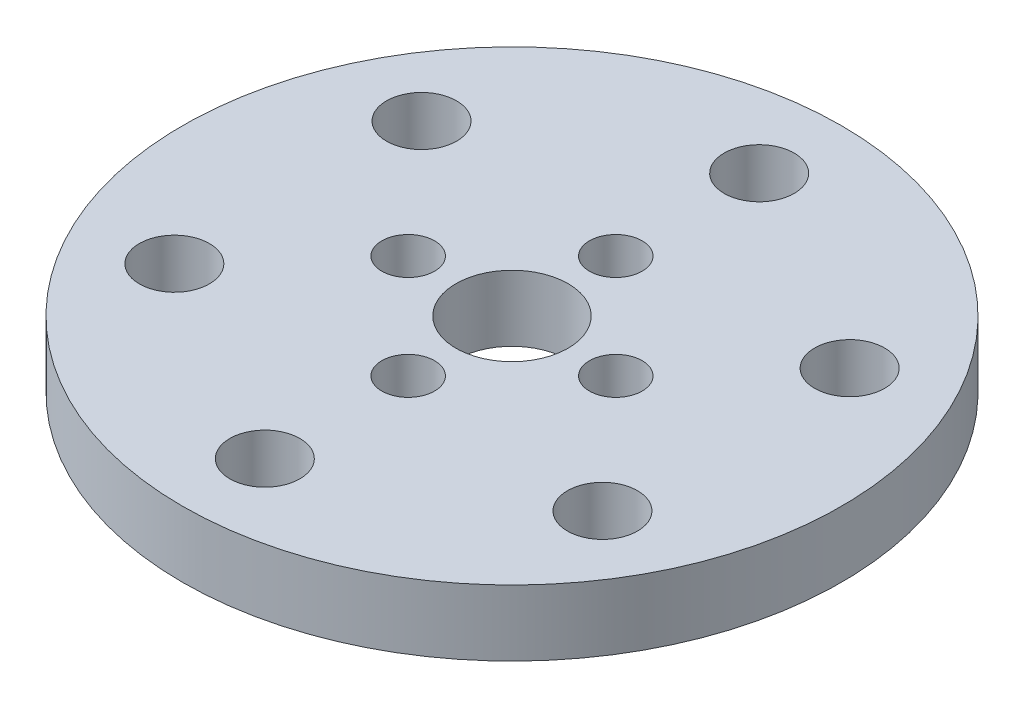
ISO-10303-21;
HEADER;
FILE_DESCRIPTION(('STEP AP214'),'2;1');
FILE_NAME('part.step','',(''),(''),'','','');
FILE_SCHEMA(('AUTOMOTIVE_DESIGN { 1 0 10303 214 1 1 1 1 }'));
ENDSEC;
DATA;
#1=APPLICATION_CONTEXT('core data for automotive mechanical design processes');
#2=APPLICATION_PROTOCOL_DEFINITION('international standard','automotive_design',2000,#1);
#3=PRODUCT_CONTEXT('',#1,'mechanical');
#4=PRODUCT('Part','Part','',(#3));
#5=PRODUCT_RELATED_PRODUCT_CATEGORY('part','',(#4));
#6=PRODUCT_DEFINITION_FORMATION('','',#4);
#7=PRODUCT_DEFINITION_CONTEXT('part definition',#1,'design');
#8=PRODUCT_DEFINITION('design','',#6,#7);
#9=PRODUCT_DEFINITION_SHAPE('','',#8);
#10=(LENGTH_UNIT() NAMED_UNIT(*) SI_UNIT(.MILLI.,.METRE.));
#11=(NAMED_UNIT(*) PLANE_ANGLE_UNIT() SI_UNIT($,.RADIAN.));
#12=(NAMED_UNIT(*) SI_UNIT($,.STERADIAN.) SOLID_ANGLE_UNIT());
#13=UNCERTAINTY_MEASURE_WITH_UNIT(LENGTH_MEASURE(1.E-05),#10,'distance_accuracy_value','');
#14=(GEOMETRIC_REPRESENTATION_CONTEXT(3) GLOBAL_UNCERTAINTY_ASSIGNED_CONTEXT((#13)) GLOBAL_UNIT_ASSIGNED_CONTEXT((#10,
#11,#12)) REPRESENTATION_CONTEXT('',''));
#15=CARTESIAN_POINT('',(0.,0.,0.));
#16=DIRECTION('',(0.,0.,1.));
#17=DIRECTION('',(1.,0.,0.));
#18=AXIS2_PLACEMENT_3D('',#15,#16,#17);
#19=CARTESIAN_POINT('',(0.,5.08,0.));
#20=DIRECTION('',(0.,-1.,0.));
#21=DIRECTION('',(0.,0.,-1.));
#22=AXIS2_PLACEMENT_3D('',#19,#20,#21);
#23=CYLINDRICAL_SURFACE('',#22,25.4);
#24=CARTESIAN_POINT('',(0.,5.08,0.));
#25=DIRECTION('',(0.,1.,0.));
#26=DIRECTION('',(0.,0.,1.));
#27=AXIS2_PLACEMENT_3D('',#24,#25,#26);
#28=CIRCLE('',#27,25.4);
#29=CARTESIAN_POINT('',(0.,5.08,25.4));
#30=VERTEX_POINT('',#29);
#31=EDGE_CURVE('E10',#30,#30,#28,.T.);
#32=ORIENTED_EDGE('',*,*,#31,.F.);
#33=EDGE_LOOP('',(#32));
#34=FACE_BOUND('',#33,.T.);
#35=CARTESIAN_POINT('',(0.,0.,0.));
#36=DIRECTION('',(0.,1.,0.));
#37=DIRECTION('',(0.,0.,1.));
#38=AXIS2_PLACEMENT_3D('',#35,#36,#37);
#39=CIRCLE('',#38,25.4);
#40=CARTESIAN_POINT('',(0.,0.,25.4));
#41=VERTEX_POINT('',#40);
#42=EDGE_CURVE('E33',#41,#41,#39,.T.);
#43=ORIENTED_EDGE('',*,*,#42,.T.);
#44=EDGE_LOOP('',(#43));
#45=FACE_BOUND('',#44,.T.);
#46=ADVANCED_FACE('F30',(#34,#45),#23,.T.);
#47=CARTESIAN_POINT('',(0.,5.08,0.));
#48=DIRECTION('',(0.,1.,0.));
#49=DIRECTION('',(0.,0.,1.));
#50=AXIS2_PLACEMENT_3D('',#47,#48,#49);
#51=PLANE('',#50);
#52=CARTESIAN_POINT('',(8.001,5.08,0.));
#53=DIRECTION('',(0.,-1.,0.));
#54=DIRECTION('',(0.,0.,-1.));
#55=AXIS2_PLACEMENT_3D('',#52,#53,#54);
#56=CIRCLE('',#55,2.032);
#57=CARTESIAN_POINT('',(8.001,5.08,-2.03200000000008));
#58=VERTEX_POINT('',#57);
#59=EDGE_CURVE('E99',#58,#58,#56,.T.);
#60=ORIENTED_EDGE('',*,*,#59,.T.);
#61=EDGE_LOOP('',(#60));
#62=FACE_BOUND('',#61,.T.);
#63=CARTESIAN_POINT('',(0.,5.08,8.001));
#64=DIRECTION('',(0.,-1.,0.));
#65=DIRECTION('',(0.,0.,-1.));
#66=AXIS2_PLACEMENT_3D('',#63,#64,#65);
#67=CIRCLE('',#66,2.032);
#68=CARTESIAN_POINT('',(0.,5.08,5.969));
#69=VERTEX_POINT('',#68);
#70=EDGE_CURVE('E93',#69,#69,#67,.T.);
#71=ORIENTED_EDGE('',*,*,#70,.T.);
#72=EDGE_LOOP('',(#71));
#73=FACE_BOUND('',#72,.T.);
#74=CARTESIAN_POINT('',(-8.001,5.08,0.));
#75=DIRECTION('',(0.,-1.,0.));
#76=DIRECTION('',(0.,0.,-1.));
#77=AXIS2_PLACEMENT_3D('',#74,#75,#76);
#78=CIRCLE('',#77,2.032);
#79=CARTESIAN_POINT('',(-8.001,5.08,-2.03199999999997));
#80=VERTEX_POINT('',#79);
#81=EDGE_CURVE('E87',#80,#80,#78,.T.);
#82=ORIENTED_EDGE('',*,*,#81,.T.);
#83=EDGE_LOOP('',(#82));
#84=FACE_BOUND('',#83,.T.);
#85=CARTESIAN_POINT('',(0.,5.08,-8.001));
#86=DIRECTION('',(0.,-1.,0.));
#87=DIRECTION('',(0.,0.,-1.));
#88=AXIS2_PLACEMENT_3D('',#85,#86,#87);
#89=CIRCLE('',#88,2.032);
#90=CARTESIAN_POINT('',(0.,5.08,-10.033));
#91=VERTEX_POINT('',#90);
#92=EDGE_CURVE('E81',#91,#91,#89,.T.);
#93=ORIENTED_EDGE('',*,*,#92,.T.);
#94=EDGE_LOOP('',(#93));
#95=FACE_BOUND('',#94,.T.);
#96=CARTESIAN_POINT('',(0.,5.08,0.));
#97=DIRECTION('',(0.,-1.,0.));
#98=DIRECTION('',(0.,0.,-1.));
#99=AXIS2_PLACEMENT_3D('',#96,#97,#98);
#100=CIRCLE('',#99,4.318);
#101=CARTESIAN_POINT('',(0.,5.08,-4.318));
#102=VERTEX_POINT('',#101);
#103=EDGE_CURVE('E75',#102,#102,#100,.T.);
#104=ORIENTED_EDGE('',*,*,#103,.T.);
#105=EDGE_LOOP('',(#104));
#106=FACE_BOUND('',#105,.T.);
#107=CARTESIAN_POINT('',(16.4977839420936,5.08,9.52499999999999));
#108=DIRECTION('',(0.,1.,0.));
#109=DIRECTION('',(0.,0.,1.));
#110=AXIS2_PLACEMENT_3D('',#107,#108,#109);
#111=CIRCLE('',#110,2.69875);
#112=CARTESIAN_POINT('',(16.4977839420936,5.08,12.22375));
#113=VERTEX_POINT('',#112);
#114=EDGE_CURVE('E72',#113,#113,#111,.T.);
#115=ORIENTED_EDGE('',*,*,#114,.F.);
#116=EDGE_LOOP('',(#115));
#117=FACE_BOUND('',#116,.T.);
#118=CARTESIAN_POINT('',(16.4977839420936,5.08,-9.52500000000001));
#119=DIRECTION('',(0.,1.,0.));
#120=DIRECTION('',(0.,0.,1.));
#121=AXIS2_PLACEMENT_3D('',#118,#119,#120);
#122=CIRCLE('',#121,2.69875);
#123=CARTESIAN_POINT('',(16.4977839420936,5.08,-6.82625000000001));
#124=VERTEX_POINT('',#123);
#125=EDGE_CURVE('E66',#124,#124,#122,.T.);
#126=ORIENTED_EDGE('',*,*,#125,.F.);
#127=EDGE_LOOP('',(#126));
#128=FACE_BOUND('',#127,.T.);
#129=CARTESIAN_POINT('',(0.,5.08,-19.05));
#130=DIRECTION('',(0.,1.,0.));
#131=DIRECTION('',(0.,0.,1.));
#132=AXIS2_PLACEMENT_3D('',#129,#130,#131);
#133=CIRCLE('',#132,2.69875);
#134=CARTESIAN_POINT('',(0.,5.08,-16.35125));
#135=VERTEX_POINT('',#134);
#136=EDGE_CURVE('E60',#135,#135,#133,.T.);
#137=ORIENTED_EDGE('',*,*,#136,.F.);
#138=EDGE_LOOP('',(#137));
#139=FACE_BOUND('',#138,.T.);
#140=CARTESIAN_POINT('',(-16.4977839420936,5.08,-9.525));
#141=DIRECTION('',(0.,1.,0.));
#142=DIRECTION('',(0.,0.,1.));
#143=AXIS2_PLACEMENT_3D('',#140,#141,#142);
#144=CIRCLE('',#143,2.69875);
#145=CARTESIAN_POINT('',(-16.4977839420936,5.08,-6.82625));
#146=VERTEX_POINT('',#145);
#147=EDGE_CURVE('E54',#146,#146,#144,.T.);
#148=ORIENTED_EDGE('',*,*,#147,.F.);
#149=EDGE_LOOP('',(#148));
#150=FACE_BOUND('',#149,.T.);
#151=CARTESIAN_POINT('',(-16.4977839420936,5.08,9.525));
#152=DIRECTION('',(0.,1.,0.));
#153=DIRECTION('',(0.,0.,1.));
#154=AXIS2_PLACEMENT_3D('',#151,#152,#153);
#155=CIRCLE('',#154,2.69875);
#156=CARTESIAN_POINT('',(-16.4977839420936,5.08,12.22375));
#157=VERTEX_POINT('',#156);
#158=EDGE_CURVE('E48',#157,#157,#155,.T.);
#159=ORIENTED_EDGE('',*,*,#158,.F.);
#160=EDGE_LOOP('',(#159));
#161=FACE_BOUND('',#160,.T.);
#162=CARTESIAN_POINT('',(0.,5.08,19.05));
#163=DIRECTION('',(0.,1.,0.));
#164=DIRECTION('',(0.,0.,1.));
#165=AXIS2_PLACEMENT_3D('',#162,#163,#164);
#166=CIRCLE('',#165,2.69875);
#167=CARTESIAN_POINT('',(0.,5.08,21.74875));
#168=VERTEX_POINT('',#167);
#169=EDGE_CURVE('E42',#168,#168,#166,.T.);
#170=ORIENTED_EDGE('',*,*,#169,.F.);
#171=EDGE_LOOP('',(#170));
#172=FACE_BOUND('',#171,.T.);
#173=ORIENTED_EDGE('',*,*,#31,.T.);
#174=EDGE_LOOP('',(#173));
#175=FACE_BOUND('',#174,.T.);
#176=ADVANCED_FACE('F108',(#62,#73,#84,#95,#106,#117,#128,#139,#150,#161,#172,#175),#51,.T.);
#177=CARTESIAN_POINT('',(0.,0.,0.));
#178=DIRECTION('',(0.,1.,0.));
#179=DIRECTION('',(0.,0.,1.));
#180=AXIS2_PLACEMENT_3D('',#177,#178,#179);
#181=PLANE('',#180);
#182=CARTESIAN_POINT('',(8.001,0.,0.));
#183=DIRECTION('',(0.,-1.,0.));
#184=DIRECTION('',(0.,0.,-1.));
#185=AXIS2_PLACEMENT_3D('',#182,#183,#184);
#186=CIRCLE('',#185,2.032);
#187=CARTESIAN_POINT('',(8.001,0.,-2.03200000000008));
#188=VERTEX_POINT('',#187);
#189=EDGE_CURVE('E102',#188,#188,#186,.T.);
#190=ORIENTED_EDGE('',*,*,#189,.F.);
#191=EDGE_LOOP('',(#190));
#192=FACE_BOUND('',#191,.T.);
#193=CARTESIAN_POINT('',(0.,0.,8.001));
#194=DIRECTION('',(0.,-1.,0.));
#195=DIRECTION('',(0.,0.,-1.));
#196=AXIS2_PLACEMENT_3D('',#193,#194,#195);
#197=CIRCLE('',#196,2.032);
#198=CARTESIAN_POINT('',(0.,0.,5.969));
#199=VERTEX_POINT('',#198);
#200=EDGE_CURVE('E96',#199,#199,#197,.T.);
#201=ORIENTED_EDGE('',*,*,#200,.F.);
#202=EDGE_LOOP('',(#201));
#203=FACE_BOUND('',#202,.T.);
#204=CARTESIAN_POINT('',(-8.001,0.,0.));
#205=DIRECTION('',(0.,-1.,0.));
#206=DIRECTION('',(0.,0.,-1.));
#207=AXIS2_PLACEMENT_3D('',#204,#205,#206);
#208=CIRCLE('',#207,2.032);
#209=CARTESIAN_POINT('',(-8.001,0.,-2.03199999999997));
#210=VERTEX_POINT('',#209);
#211=EDGE_CURVE('E90',#210,#210,#208,.T.);
#212=ORIENTED_EDGE('',*,*,#211,.F.);
#213=EDGE_LOOP('',(#212));
#214=FACE_BOUND('',#213,.T.);
#215=CARTESIAN_POINT('',(0.,0.,-8.001));
#216=DIRECTION('',(0.,-1.,0.));
#217=DIRECTION('',(0.,0.,-1.));
#218=AXIS2_PLACEMENT_3D('',#215,#216,#217);
#219=CIRCLE('',#218,2.032);
#220=CARTESIAN_POINT('',(0.,0.,-10.033));
#221=VERTEX_POINT('',#220);
#222=EDGE_CURVE('E84',#221,#221,#219,.T.);
#223=ORIENTED_EDGE('',*,*,#222,.F.);
#224=EDGE_LOOP('',(#223));
#225=FACE_BOUND('',#224,.T.);
#226=CARTESIAN_POINT('',(0.,0.,0.));
#227=DIRECTION('',(0.,-1.,0.));
#228=DIRECTION('',(0.,0.,-1.));
#229=AXIS2_PLACEMENT_3D('',#226,#227,#228);
#230=CIRCLE('',#229,4.318);
#231=CARTESIAN_POINT('',(0.,0.,-4.318));
#232=VERTEX_POINT('',#231);
#233=EDGE_CURVE('E78',#232,#232,#230,.T.);
#234=ORIENTED_EDGE('',*,*,#233,.F.);
#235=EDGE_LOOP('',(#234));
#236=FACE_BOUND('',#235,.T.);
#237=CARTESIAN_POINT('',(16.4977839420936,0.,9.52499999999999));
#238=DIRECTION('',(0.,1.,0.));
#239=DIRECTION('',(0.,0.,1.));
#240=AXIS2_PLACEMENT_3D('',#237,#238,#239);
#241=CIRCLE('',#240,2.69875);
#242=CARTESIAN_POINT('',(16.4977839420936,0.,12.22375));
#243=VERTEX_POINT('',#242);
#244=EDGE_CURVE('E69',#243,#243,#241,.T.);
#245=ORIENTED_EDGE('',*,*,#244,.T.);
#246=EDGE_LOOP('',(#245));
#247=FACE_BOUND('',#246,.T.);
#248=CARTESIAN_POINT('',(16.4977839420936,0.,-9.52500000000001));
#249=DIRECTION('',(0.,1.,0.));
#250=DIRECTION('',(0.,0.,1.));
#251=AXIS2_PLACEMENT_3D('',#248,#249,#250);
#252=CIRCLE('',#251,2.69875);
#253=CARTESIAN_POINT('',(16.4977839420936,0.,-6.82625000000001));
#254=VERTEX_POINT('',#253);
#255=EDGE_CURVE('E63',#254,#254,#252,.T.);
#256=ORIENTED_EDGE('',*,*,#255,.T.);
#257=EDGE_LOOP('',(#256));
#258=FACE_BOUND('',#257,.T.);
#259=CARTESIAN_POINT('',(0.,0.,-19.05));
#260=DIRECTION('',(0.,1.,0.));
#261=DIRECTION('',(0.,0.,1.));
#262=AXIS2_PLACEMENT_3D('',#259,#260,#261);
#263=CIRCLE('',#262,2.69875);
#264=CARTESIAN_POINT('',(0.,0.,-16.35125));
#265=VERTEX_POINT('',#264);
#266=EDGE_CURVE('E57',#265,#265,#263,.T.);
#267=ORIENTED_EDGE('',*,*,#266,.T.);
#268=EDGE_LOOP('',(#267));
#269=FACE_BOUND('',#268,.T.);
#270=CARTESIAN_POINT('',(-16.4977839420936,0.,-9.525));
#271=DIRECTION('',(0.,1.,0.));
#272=DIRECTION('',(0.,0.,1.));
#273=AXIS2_PLACEMENT_3D('',#270,#271,#272);
#274=CIRCLE('',#273,2.69875);
#275=CARTESIAN_POINT('',(-16.4977839420936,0.,-6.82625));
#276=VERTEX_POINT('',#275);
#277=EDGE_CURVE('E51',#276,#276,#274,.T.);
#278=ORIENTED_EDGE('',*,*,#277,.T.);
#279=EDGE_LOOP('',(#278));
#280=FACE_BOUND('',#279,.T.);
#281=CARTESIAN_POINT('',(-16.4977839420936,0.,9.525));
#282=DIRECTION('',(0.,1.,0.));
#283=DIRECTION('',(0.,0.,1.));
#284=AXIS2_PLACEMENT_3D('',#281,#282,#283);
#285=CIRCLE('',#284,2.69875);
#286=CARTESIAN_POINT('',(-16.4977839420936,0.,12.22375));
#287=VERTEX_POINT('',#286);
#288=EDGE_CURVE('E45',#287,#287,#285,.T.);
#289=ORIENTED_EDGE('',*,*,#288,.T.);
#290=EDGE_LOOP('',(#289));
#291=FACE_BOUND('',#290,.T.);
#292=CARTESIAN_POINT('',(0.,0.,19.05));
#293=DIRECTION('',(0.,1.,0.));
#294=DIRECTION('',(0.,0.,1.));
#295=AXIS2_PLACEMENT_3D('',#292,#293,#294);
#296=CIRCLE('',#295,2.69875);
#297=CARTESIAN_POINT('',(0.,0.,21.74875));
#298=VERTEX_POINT('',#297);
#299=EDGE_CURVE('E40',#298,#298,#296,.T.);
#300=ORIENTED_EDGE('',*,*,#299,.T.);
#301=EDGE_LOOP('',(#300));
#302=FACE_BOUND('',#301,.T.);
#303=ORIENTED_EDGE('',*,*,#42,.F.);
#304=EDGE_LOOP('',(#303));
#305=FACE_BOUND('',#304,.T.);
#306=ADVANCED_FACE('F118',(#192,#203,#214,#225,#236,#247,#258,#269,#280,#291,#302,#305),#181,.F.);
#307=CARTESIAN_POINT('',(0.,0.,19.05));
#308=DIRECTION('',(0.,1.,0.));
#309=DIRECTION('',(0.,0.,1.));
#310=AXIS2_PLACEMENT_3D('',#307,#308,#309);
#311=CYLINDRICAL_SURFACE('',#310,2.69875);
#312=ORIENTED_EDGE('',*,*,#299,.F.);
#313=EDGE_LOOP('',(#312));
#314=FACE_BOUND('',#313,.T.);
#315=ORIENTED_EDGE('',*,*,#169,.T.);
#316=EDGE_LOOP('',(#315));
#317=FACE_BOUND('',#316,.T.);
#318=ADVANCED_FACE('F121',(#314,#317),#311,.F.);
#319=CARTESIAN_POINT('',(-16.4977839420936,0.,9.525));
#320=DIRECTION('',(0.,1.,0.));
#321=DIRECTION('',(0.,0.,1.));
#322=AXIS2_PLACEMENT_3D('',#319,#320,#321);
#323=CYLINDRICAL_SURFACE('',#322,2.69875);
#324=ORIENTED_EDGE('',*,*,#288,.F.);
#325=EDGE_LOOP('',(#324));
#326=FACE_BOUND('',#325,.T.);
#327=ORIENTED_EDGE('',*,*,#158,.T.);
#328=EDGE_LOOP('',(#327));
#329=FACE_BOUND('',#328,.T.);
#330=ADVANCED_FACE('F155',(#326,#329),#323,.F.);
#331=CARTESIAN_POINT('',(-16.4977839420936,0.,-9.525));
#332=DIRECTION('',(0.,1.,0.));
#333=DIRECTION('',(0.,0.,1.));
#334=AXIS2_PLACEMENT_3D('',#331,#332,#333);
#335=CYLINDRICAL_SURFACE('',#334,2.69875);
#336=ORIENTED_EDGE('',*,*,#277,.F.);
#337=EDGE_LOOP('',(#336));
#338=FACE_BOUND('',#337,.T.);
#339=ORIENTED_EDGE('',*,*,#147,.T.);
#340=EDGE_LOOP('',(#339));
#341=FACE_BOUND('',#340,.T.);
#342=ADVANCED_FACE('F159',(#338,#341),#335,.F.);
#343=CARTESIAN_POINT('',(0.,0.,-19.05));
#344=DIRECTION('',(0.,1.,0.));
#345=DIRECTION('',(0.,0.,1.));
#346=AXIS2_PLACEMENT_3D('',#343,#344,#345);
#347=CYLINDRICAL_SURFACE('',#346,2.69875);
#348=ORIENTED_EDGE('',*,*,#266,.F.);
#349=EDGE_LOOP('',(#348));
#350=FACE_BOUND('',#349,.T.);
#351=ORIENTED_EDGE('',*,*,#136,.T.);
#352=EDGE_LOOP('',(#351));
#353=FACE_BOUND('',#352,.T.);
#354=ADVANCED_FACE('F163',(#350,#353),#347,.F.);
#355=CARTESIAN_POINT('',(16.4977839420936,0.,-9.52500000000001));
#356=DIRECTION('',(0.,1.,0.));
#357=DIRECTION('',(0.,0.,1.));
#358=AXIS2_PLACEMENT_3D('',#355,#356,#357);
#359=CYLINDRICAL_SURFACE('',#358,2.69875);
#360=ORIENTED_EDGE('',*,*,#255,.F.);
#361=EDGE_LOOP('',(#360));
#362=FACE_BOUND('',#361,.T.);
#363=ORIENTED_EDGE('',*,*,#125,.T.);
#364=EDGE_LOOP('',(#363));
#365=FACE_BOUND('',#364,.T.);
#366=ADVANCED_FACE('F167',(#362,#365),#359,.F.);
#367=CARTESIAN_POINT('',(16.4977839420936,0.,9.52499999999999));
#368=DIRECTION('',(0.,1.,0.));
#369=DIRECTION('',(0.,0.,1.));
#370=AXIS2_PLACEMENT_3D('',#367,#368,#369);
#371=CYLINDRICAL_SURFACE('',#370,2.69875);
#372=ORIENTED_EDGE('',*,*,#244,.F.);
#373=EDGE_LOOP('',(#372));
#374=FACE_BOUND('',#373,.T.);
#375=ORIENTED_EDGE('',*,*,#114,.T.);
#376=EDGE_LOOP('',(#375));
#377=FACE_BOUND('',#376,.T.);
#378=ADVANCED_FACE('F171',(#374,#377),#371,.F.);
#379=CARTESIAN_POINT('',(0.,5.08,0.));
#380=DIRECTION('',(0.,-1.,0.));
#381=DIRECTION('',(0.,0.,-1.));
#382=AXIS2_PLACEMENT_3D('',#379,#380,#381);
#383=CYLINDRICAL_SURFACE('',#382,4.318);
#384=ORIENTED_EDGE('',*,*,#103,.F.);
#385=EDGE_LOOP('',(#384));
#386=FACE_BOUND('',#385,.T.);
#387=ORIENTED_EDGE('',*,*,#233,.T.);
#388=EDGE_LOOP('',(#387));
#389=FACE_BOUND('',#388,.T.);
#390=ADVANCED_FACE('F175',(#386,#389),#383,.F.);
#391=CARTESIAN_POINT('',(0.,5.08,-8.001));
#392=DIRECTION('',(0.,-1.,0.));
#393=DIRECTION('',(0.,0.,-1.));
#394=AXIS2_PLACEMENT_3D('',#391,#392,#393);
#395=CYLINDRICAL_SURFACE('',#394,2.032);
#396=ORIENTED_EDGE('',*,*,#92,.F.);
#397=EDGE_LOOP('',(#396));
#398=FACE_BOUND('',#397,.T.);
#399=ORIENTED_EDGE('',*,*,#222,.T.);
#400=EDGE_LOOP('',(#399));
#401=FACE_BOUND('',#400,.T.);
#402=ADVANCED_FACE('F179',(#398,#401),#395,.F.);
#403=CARTESIAN_POINT('',(-8.001,5.08,0.));
#404=DIRECTION('',(0.,-1.,0.));
#405=DIRECTION('',(0.,0.,-1.));
#406=AXIS2_PLACEMENT_3D('',#403,#404,#405);
#407=CYLINDRICAL_SURFACE('',#406,2.032);
#408=ORIENTED_EDGE('',*,*,#81,.F.);
#409=EDGE_LOOP('',(#408));
#410=FACE_BOUND('',#409,.T.);
#411=ORIENTED_EDGE('',*,*,#211,.T.);
#412=EDGE_LOOP('',(#411));
#413=FACE_BOUND('',#412,.T.);
#414=ADVANCED_FACE('F183',(#410,#413),#407,.F.);
#415=CARTESIAN_POINT('',(0.,5.08,8.001));
#416=DIRECTION('',(0.,-1.,0.));
#417=DIRECTION('',(0.,0.,-1.));
#418=AXIS2_PLACEMENT_3D('',#415,#416,#417);
#419=CYLINDRICAL_SURFACE('',#418,2.032);
#420=ORIENTED_EDGE('',*,*,#70,.F.);
#421=EDGE_LOOP('',(#420));
#422=FACE_BOUND('',#421,.T.);
#423=ORIENTED_EDGE('',*,*,#200,.T.);
#424=EDGE_LOOP('',(#423));
#425=FACE_BOUND('',#424,.T.);
#426=ADVANCED_FACE('F114',(#422,#425),#419,.F.);
#427=CARTESIAN_POINT('',(8.001,5.08,0.));
#428=DIRECTION('',(0.,-1.,0.));
#429=DIRECTION('',(0.,0.,-1.));
#430=AXIS2_PLACEMENT_3D('',#427,#428,#429);
#431=CYLINDRICAL_SURFACE('',#430,2.032);
#432=ORIENTED_EDGE('',*,*,#59,.F.);
#433=EDGE_LOOP('',(#432));
#434=FACE_BOUND('',#433,.T.);
#435=ORIENTED_EDGE('',*,*,#189,.T.);
#436=EDGE_LOOP('',(#435));
#437=FACE_BOUND('',#436,.T.);
#438=ADVANCED_FACE('F111',(#434,#437),#431,.F.);
#439=CLOSED_SHELL('',(#46,#176,#306,#318,#330,#342,#354,#366,#378,#390,#402,#414,#426,#438));
#440=MANIFOLD_SOLID_BREP('B2',#439);
#441=ADVANCED_BREP_SHAPE_REPRESENTATION('',(#18,#440),#14);
#442=SHAPE_DEFINITION_REPRESENTATION(#9,#441);
ENDSEC;
END-ISO-10303-21;
